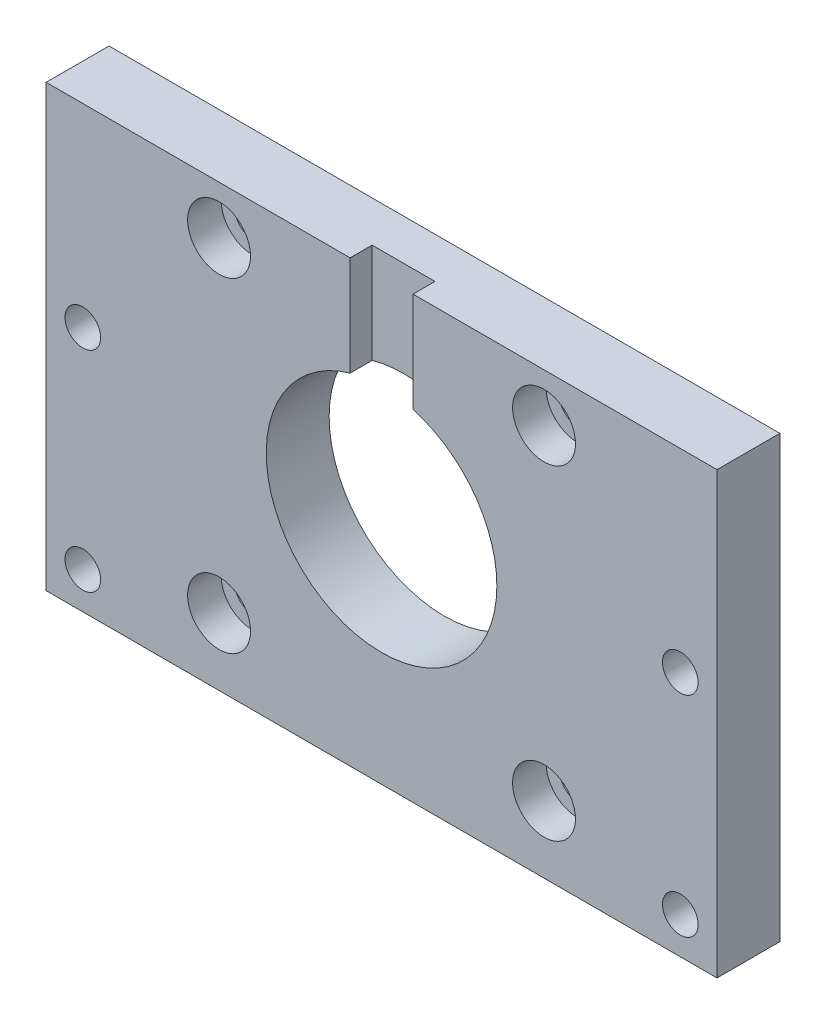
ISO-10303-21;
HEADER;
FILE_DESCRIPTION(('STEP AP214'),'2;1');
FILE_NAME('part.step','',(''),(''),'','','');
FILE_SCHEMA(('AUTOMOTIVE_DESIGN { 1 0 10303 214 1 1 1 1 }'));
ENDSEC;
DATA;
#1=APPLICATION_CONTEXT('core data for automotive mechanical design processes');
#2=APPLICATION_PROTOCOL_DEFINITION('international standard','automotive_design',2000,#1);
#3=PRODUCT_CONTEXT('',#1,'mechanical');
#4=PRODUCT('Part','Part','',(#3));
#5=PRODUCT_RELATED_PRODUCT_CATEGORY('part','',(#4));
#6=PRODUCT_DEFINITION_FORMATION('','',#4);
#7=PRODUCT_DEFINITION_CONTEXT('part definition',#1,'design');
#8=PRODUCT_DEFINITION('design','',#6,#7);
#9=PRODUCT_DEFINITION_SHAPE('','',#8);
#10=(LENGTH_UNIT() NAMED_UNIT(*) SI_UNIT(.MILLI.,.METRE.));
#11=(NAMED_UNIT(*) PLANE_ANGLE_UNIT() SI_UNIT($,.RADIAN.));
#12=(NAMED_UNIT(*) SI_UNIT($,.STERADIAN.) SOLID_ANGLE_UNIT());
#13=UNCERTAINTY_MEASURE_WITH_UNIT(LENGTH_MEASURE(1.E-05),#10,'distance_accuracy_value','');
#14=(GEOMETRIC_REPRESENTATION_CONTEXT(3) GLOBAL_UNCERTAINTY_ASSIGNED_CONTEXT((#13)) GLOBAL_UNIT_ASSIGNED_CONTEXT((#10,
#11,#12)) REPRESENTATION_CONTEXT('',''));
#15=CARTESIAN_POINT('',(0.,0.,0.));
#16=DIRECTION('',(0.,0.,1.));
#17=DIRECTION('',(1.,0.,0.));
#18=AXIS2_PLACEMENT_3D('',#15,#16,#17);
#19=CARTESIAN_POINT('',(3.5,3.5,3.));
#20=DIRECTION('',(0.,0.,-1.));
#21=DIRECTION('',(-1.,0.,0.));
#22=AXIS2_PLACEMENT_3D('',#19,#20,#21);
#23=CYLINDRICAL_SURFACE('',#22,3.);
#24=CARTESIAN_POINT('',(3.5,3.5,0.));
#25=DIRECTION('',(0.,0.,-1.));
#26=DIRECTION('',(-1.,0.,0.));
#27=AXIS2_PLACEMENT_3D('',#24,#25,#26);
#28=CIRCLE('',#27,3.);
#29=CARTESIAN_POINT('',(0.5,3.5,0.));
#30=VERTEX_POINT('',#29);
#31=EDGE_CURVE('E209',#30,#30,#28,.F.);
#32=ORIENTED_EDGE('',*,*,#31,.F.);
#33=EDGE_LOOP('',(#32));
#34=FACE_BOUND('',#33,.T.);
#35=CARTESIAN_POINT('',(3.5,3.5,3.));
#36=DIRECTION('',(0.,0.,-1.));
#37=DIRECTION('',(-1.,0.,0.));
#38=AXIS2_PLACEMENT_3D('',#35,#36,#37);
#39=CIRCLE('',#38,3.);
#40=CARTESIAN_POINT('',(0.5,3.5,3.));
#41=VERTEX_POINT('',#40);
#42=EDGE_CURVE('E21',#41,#41,#39,.F.);
#43=ORIENTED_EDGE('',*,*,#42,.T.);
#44=EDGE_LOOP('',(#43));
#45=FACE_BOUND('',#44,.T.);
#46=ADVANCED_FACE('F17',(#34,#45),#23,.F.);
#47=CARTESIAN_POINT('',(60.5,23.5,3.));
#48=DIRECTION('',(0.,0.,-1.));
#49=DIRECTION('',(-1.,0.,0.));
#50=AXIS2_PLACEMENT_3D('',#47,#48,#49);
#51=CYLINDRICAL_SURFACE('',#50,3.);
#52=CARTESIAN_POINT('',(60.5,23.5,0.));
#53=DIRECTION('',(0.,0.,-1.));
#54=DIRECTION('',(-1.,0.,0.));
#55=AXIS2_PLACEMENT_3D('',#52,#53,#54);
#56=CIRCLE('',#55,3.);
#57=CARTESIAN_POINT('',(57.5,23.5,0.));
#58=VERTEX_POINT('',#57);
#59=EDGE_CURVE('E206',#58,#58,#56,.F.);
#60=ORIENTED_EDGE('',*,*,#59,.F.);
#61=EDGE_LOOP('',(#60));
#62=FACE_BOUND('',#61,.T.);
#63=CARTESIAN_POINT('',(60.5,23.5,3.));
#64=DIRECTION('',(0.,0.,-1.));
#65=DIRECTION('',(-1.,0.,0.));
#66=AXIS2_PLACEMENT_3D('',#63,#64,#65);
#67=CIRCLE('',#66,3.);
#68=CARTESIAN_POINT('',(57.5,23.5,3.));
#69=VERTEX_POINT('',#68);
#70=EDGE_CURVE('E226',#69,#69,#67,.F.);
#71=ORIENTED_EDGE('',*,*,#70,.T.);
#72=EDGE_LOOP('',(#71));
#73=FACE_BOUND('',#72,.T.);
#74=ADVANCED_FACE('F317',(#62,#73),#51,.F.);
#75=CARTESIAN_POINT('',(60.5,3.5,3.));
#76=DIRECTION('',(0.,0.,-1.));
#77=DIRECTION('',(-1.,0.,0.));
#78=AXIS2_PLACEMENT_3D('',#75,#76,#77);
#79=CYLINDRICAL_SURFACE('',#78,3.);
#80=CARTESIAN_POINT('',(60.5,3.5,0.));
#81=DIRECTION('',(0.,0.,-1.));
#82=DIRECTION('',(-1.,0.,0.));
#83=AXIS2_PLACEMENT_3D('',#80,#81,#82);
#84=CIRCLE('',#83,3.);
#85=CARTESIAN_POINT('',(57.5,3.5,0.));
#86=VERTEX_POINT('',#85);
#87=EDGE_CURVE('E203',#86,#86,#84,.F.);
#88=ORIENTED_EDGE('',*,*,#87,.F.);
#89=EDGE_LOOP('',(#88));
#90=FACE_BOUND('',#89,.T.);
#91=CARTESIAN_POINT('',(60.5,3.5,3.));
#92=DIRECTION('',(0.,0.,-1.));
#93=DIRECTION('',(-1.,0.,0.));
#94=AXIS2_PLACEMENT_3D('',#91,#92,#93);
#95=CIRCLE('',#94,3.);
#96=CARTESIAN_POINT('',(57.5,3.5,3.));
#97=VERTEX_POINT('',#96);
#98=EDGE_CURVE('E224',#97,#97,#95,.F.);
#99=ORIENTED_EDGE('',*,*,#98,.T.);
#100=EDGE_LOOP('',(#99));
#101=FACE_BOUND('',#100,.T.);
#102=ADVANCED_FACE('F313',(#90,#101),#79,.F.);
#103=CARTESIAN_POINT('',(47.5,37.39,0.));
#104=DIRECTION('',(0.,0.,1.));
#105=DIRECTION('',(1.,0.,0.));
#106=AXIS2_PLACEMENT_3D('',#103,#104,#105);
#107=CYLINDRICAL_SURFACE('',#106,1.7);
#108=CARTESIAN_POINT('',(47.5,37.39,2.8));
#109=DIRECTION('',(0.,0.,1.));
#110=DIRECTION('',(1.,0.,0.));
#111=AXIS2_PLACEMENT_3D('',#108,#109,#110);
#112=CIRCLE('',#111,1.7);
#113=CARTESIAN_POINT('',(49.2,37.39,2.8));
#114=VERTEX_POINT('',#113);
#115=EDGE_CURVE('E221',#114,#114,#112,.T.);
#116=ORIENTED_EDGE('',*,*,#115,.T.);
#117=EDGE_LOOP('',(#116));
#118=FACE_BOUND('',#117,.T.);
#119=CARTESIAN_POINT('',(47.5,37.39,0.));
#120=DIRECTION('',(0.,0.,1.));
#121=DIRECTION('',(1.,0.,0.));
#122=AXIS2_PLACEMENT_3D('',#119,#120,#121);
#123=CIRCLE('',#122,1.7);
#124=CARTESIAN_POINT('',(49.2,37.39,0.));
#125=VERTEX_POINT('',#124);
#126=EDGE_CURVE('E200',#125,#125,#123,.T.);
#127=ORIENTED_EDGE('',*,*,#126,.F.);
#128=EDGE_LOOP('',(#127));
#129=FACE_BOUND('',#128,.T.);
#130=ADVANCED_FACE('F309',(#118,#129),#107,.F.);
#131=CARTESIAN_POINT('',(47.5,6.39,0.));
#132=DIRECTION('',(0.,0.,1.));
#133=DIRECTION('',(1.,0.,0.));
#134=AXIS2_PLACEMENT_3D('',#131,#132,#133);
#135=CYLINDRICAL_SURFACE('',#134,1.7);
#136=CARTESIAN_POINT('',(47.5,6.39,2.8));
#137=DIRECTION('',(0.,0.,1.));
#138=DIRECTION('',(1.,0.,0.));
#139=AXIS2_PLACEMENT_3D('',#136,#137,#138);
#140=CIRCLE('',#139,1.7);
#141=CARTESIAN_POINT('',(49.2,6.39,2.8));
#142=VERTEX_POINT('',#141);
#143=EDGE_CURVE('E218',#142,#142,#140,.T.);
#144=ORIENTED_EDGE('',*,*,#143,.T.);
#145=EDGE_LOOP('',(#144));
#146=FACE_BOUND('',#145,.T.);
#147=CARTESIAN_POINT('',(47.5,6.39,0.));
#148=DIRECTION('',(0.,0.,1.));
#149=DIRECTION('',(1.,0.,0.));
#150=AXIS2_PLACEMENT_3D('',#147,#148,#149);
#151=CIRCLE('',#150,1.7);
#152=CARTESIAN_POINT('',(49.2,6.39,0.));
#153=VERTEX_POINT('',#152);
#154=EDGE_CURVE('E197',#153,#153,#151,.T.);
#155=ORIENTED_EDGE('',*,*,#154,.F.);
#156=EDGE_LOOP('',(#155));
#157=FACE_BOUND('',#156,.T.);
#158=ADVANCED_FACE('F305',(#146,#157),#135,.F.);
#159=CARTESIAN_POINT('',(16.5,37.39,0.));
#160=DIRECTION('',(0.,0.,1.));
#161=DIRECTION('',(1.,0.,0.));
#162=AXIS2_PLACEMENT_3D('',#159,#160,#161);
#163=CYLINDRICAL_SURFACE('',#162,1.7);
#164=CARTESIAN_POINT('',(16.5,37.39,2.8));
#165=DIRECTION('',(0.,0.,1.));
#166=DIRECTION('',(1.,0.,0.));
#167=AXIS2_PLACEMENT_3D('',#164,#165,#166);
#168=CIRCLE('',#167,1.7);
#169=CARTESIAN_POINT('',(18.2,37.39,2.8));
#170=VERTEX_POINT('',#169);
#171=EDGE_CURVE('E215',#170,#170,#168,.T.);
#172=ORIENTED_EDGE('',*,*,#171,.T.);
#173=EDGE_LOOP('',(#172));
#174=FACE_BOUND('',#173,.T.);
#175=CARTESIAN_POINT('',(16.5,37.39,0.));
#176=DIRECTION('',(0.,0.,1.));
#177=DIRECTION('',(1.,0.,0.));
#178=AXIS2_PLACEMENT_3D('',#175,#176,#177);
#179=CIRCLE('',#178,1.7);
#180=CARTESIAN_POINT('',(18.2,37.39,0.));
#181=VERTEX_POINT('',#180);
#182=EDGE_CURVE('E194',#181,#181,#179,.T.);
#183=ORIENTED_EDGE('',*,*,#182,.F.);
#184=EDGE_LOOP('',(#183));
#185=FACE_BOUND('',#184,.T.);
#186=ADVANCED_FACE('F301',(#174,#185),#163,.F.);
#187=CARTESIAN_POINT('',(16.5,6.39,0.));
#188=DIRECTION('',(0.,0.,1.));
#189=DIRECTION('',(1.,0.,0.));
#190=AXIS2_PLACEMENT_3D('',#187,#188,#189);
#191=CYLINDRICAL_SURFACE('',#190,1.7);
#192=CARTESIAN_POINT('',(16.5,6.39,2.8));
#193=DIRECTION('',(0.,0.,1.));
#194=DIRECTION('',(1.,0.,0.));
#195=AXIS2_PLACEMENT_3D('',#192,#193,#194);
#196=CIRCLE('',#195,1.7);
#197=CARTESIAN_POINT('',(18.2,6.39,2.8));
#198=VERTEX_POINT('',#197);
#199=EDGE_CURVE('E212',#198,#198,#196,.T.);
#200=ORIENTED_EDGE('',*,*,#199,.T.);
#201=EDGE_LOOP('',(#200));
#202=FACE_BOUND('',#201,.T.);
#203=CARTESIAN_POINT('',(16.5,6.39,0.));
#204=DIRECTION('',(0.,0.,1.));
#205=DIRECTION('',(1.,0.,0.));
#206=AXIS2_PLACEMENT_3D('',#203,#204,#205);
#207=CIRCLE('',#206,1.7);
#208=CARTESIAN_POINT('',(18.2,6.39,0.));
#209=VERTEX_POINT('',#208);
#210=EDGE_CURVE('E191',#209,#209,#207,.T.);
#211=ORIENTED_EDGE('',*,*,#210,.F.);
#212=EDGE_LOOP('',(#211));
#213=FACE_BOUND('',#212,.T.);
#214=ADVANCED_FACE('F248',(#202,#213),#191,.F.);
#215=CARTESIAN_POINT('',(29.,32.415843276,3.9));
#216=DIRECTION('',(0.,0.,1.));
#217=DIRECTION('',(1.,0.,0.));
#218=AXIS2_PLACEMENT_3D('',#215,#216,#217);
#219=PLANE('',#218);
#220=DIRECTION('',(-1.,0.,0.));
#221=VECTOR('',#220,1.);
#222=CARTESIAN_POINT('',(32.,42.,3.9));
#223=LINE('',#222,#221);
#224=CARTESIAN_POINT('',(35.,42.,3.9));
#225=VERTEX_POINT('',#224);
#226=CARTESIAN_POINT('',(29.,42.,3.9));
#227=VERTEX_POINT('',#226);
#228=EDGE_CURVE('E61',#225,#227,#223,.T.);
#229=ORIENTED_EDGE('',*,*,#228,.T.);
#230=DIRECTION('',(0.,-1.,0.));
#231=VECTOR('',#230,1.);
#232=CARTESIAN_POINT('',(29.,37.236502622,3.9));
#233=LINE('',#232,#231);
#234=CARTESIAN_POINT('',(28.9999999976637,32.4730052435961,3.9));
#235=VERTEX_POINT('',#234);
#236=EDGE_CURVE('E190',#227,#235,#233,.T.);
#237=ORIENTED_EDGE('',*,*,#236,.T.);
#238=CARTESIAN_POINT('',(32.,21.89,3.9));
#239=DIRECTION('',(0.,0.,1.));
#240=DIRECTION('',(1.,0.,0.));
#241=AXIS2_PLACEMENT_3D('',#238,#239,#240);
#242=CIRCLE('',#241,11.);
#243=CARTESIAN_POINT('',(35.0000000001657,32.4730052442114,3.9));
#244=VERTEX_POINT('',#243);
#245=EDGE_CURVE('E184',#244,#235,#242,.T.);
#246=ORIENTED_EDGE('',*,*,#245,.F.);
#247=DIRECTION('',(0.,1.,0.));
#248=VECTOR('',#247,1.);
#249=CARTESIAN_POINT('',(35.,37.236502622,3.9));
#250=LINE('',#249,#248);
#251=EDGE_CURVE('E54',#244,#225,#250,.T.);
#252=ORIENTED_EDGE('',*,*,#251,.T.);
#253=EDGE_LOOP('',(#229,#237,#246,#252));
#254=FACE_BOUND('',#253,.T.);
#255=ADVANCED_FACE('F237',(#254),#219,.T.);
#256=CARTESIAN_POINT('',(0.464,0.464,3.));
#257=DIRECTION('',(0.,0.,1.));
#258=DIRECTION('',(1.,0.,0.));
#259=AXIS2_PLACEMENT_3D('',#256,#257,#258);
#260=PLANE('',#259);
#261=CARTESIAN_POINT('',(3.5,3.5,3.));
#262=DIRECTION('',(0.,0.,-1.));
#263=DIRECTION('',(-1.,0.,0.));
#264=AXIS2_PLACEMENT_3D('',#261,#262,#263);
#265=CIRCLE('',#264,1.7);
#266=CARTESIAN_POINT('',(1.8,3.5,3.));
#267=VERTEX_POINT('',#266);
#268=EDGE_CURVE('E181',#267,#267,#265,.T.);
#269=ORIENTED_EDGE('',*,*,#268,.F.);
#270=EDGE_LOOP('',(#269));
#271=FACE_BOUND('',#270,.T.);
#272=ORIENTED_EDGE('',*,*,#42,.F.);
#273=EDGE_LOOP('',(#272));
#274=FACE_BOUND('',#273,.T.);
#275=ADVANCED_FACE('F234',(#271,#274),#260,.F.);
#276=CARTESIAN_POINT('',(57.464,20.464,3.));
#277=DIRECTION('',(0.,0.,1.));
#278=DIRECTION('',(1.,0.,0.));
#279=AXIS2_PLACEMENT_3D('',#276,#277,#278);
#280=PLANE('',#279);
#281=CARTESIAN_POINT('',(60.5,23.5,3.));
#282=DIRECTION('',(0.,0.,-1.));
#283=DIRECTION('',(-1.,0.,0.));
#284=AXIS2_PLACEMENT_3D('',#281,#282,#283);
#285=CIRCLE('',#284,1.7);
#286=CARTESIAN_POINT('',(58.8,23.5,3.));
#287=VERTEX_POINT('',#286);
#288=EDGE_CURVE('E178',#287,#287,#285,.T.);
#289=ORIENTED_EDGE('',*,*,#288,.F.);
#290=EDGE_LOOP('',(#289));
#291=FACE_BOUND('',#290,.T.);
#292=ORIENTED_EDGE('',*,*,#70,.F.);
#293=EDGE_LOOP('',(#292));
#294=FACE_BOUND('',#293,.T.);
#295=ADVANCED_FACE('F236',(#291,#294),#280,.F.);
#296=CARTESIAN_POINT('',(57.464,0.464,3.));
#297=DIRECTION('',(0.,0.,1.));
#298=DIRECTION('',(1.,0.,0.));
#299=AXIS2_PLACEMENT_3D('',#296,#297,#298);
#300=PLANE('',#299);
#301=CARTESIAN_POINT('',(60.5,3.5,3.));
#302=DIRECTION('',(0.,0.,-1.));
#303=DIRECTION('',(-1.,0.,0.));
#304=AXIS2_PLACEMENT_3D('',#301,#302,#303);
#305=CIRCLE('',#304,1.7);
#306=CARTESIAN_POINT('',(58.8,3.5,3.));
#307=VERTEX_POINT('',#306);
#308=EDGE_CURVE('E175',#307,#307,#305,.T.);
#309=ORIENTED_EDGE('',*,*,#308,.F.);
#310=EDGE_LOOP('',(#309));
#311=FACE_BOUND('',#310,.T.);
#312=ORIENTED_EDGE('',*,*,#98,.F.);
#313=EDGE_LOOP('',(#312));
#314=FACE_BOUND('',#313,.T.);
#315=ADVANCED_FACE('F245',(#311,#314),#300,.F.);
#316=CARTESIAN_POINT('',(50.536,34.354,2.8));
#317=DIRECTION('',(0.,0.,-1.));
#318=DIRECTION('',(-1.,0.,0.));
#319=AXIS2_PLACEMENT_3D('',#316,#317,#318);
#320=PLANE('',#319);
#321=ORIENTED_EDGE('',*,*,#115,.F.);
#322=EDGE_LOOP('',(#321));
#323=FACE_BOUND('',#322,.T.);
#324=CARTESIAN_POINT('',(47.5,37.39,2.8));
#325=DIRECTION('',(0.,0.,1.));
#326=DIRECTION('',(1.,0.,0.));
#327=AXIS2_PLACEMENT_3D('',#324,#325,#326);
#328=CIRCLE('',#327,3.);
#329=CARTESIAN_POINT('',(50.5,37.39,2.8));
#330=VERTEX_POINT('',#329);
#331=EDGE_CURVE('E172',#330,#330,#328,.F.);
#332=ORIENTED_EDGE('',*,*,#331,.F.);
#333=EDGE_LOOP('',(#332));
#334=FACE_BOUND('',#333,.T.);
#335=ADVANCED_FACE('F455',(#323,#334),#320,.F.);
#336=CARTESIAN_POINT('',(50.536,3.354,2.8));
#337=DIRECTION('',(0.,0.,-1.));
#338=DIRECTION('',(-1.,0.,0.));
#339=AXIS2_PLACEMENT_3D('',#336,#337,#338);
#340=PLANE('',#339);
#341=ORIENTED_EDGE('',*,*,#143,.F.);
#342=EDGE_LOOP('',(#341));
#343=FACE_BOUND('',#342,.T.);
#344=CARTESIAN_POINT('',(47.5,6.39,2.8));
#345=DIRECTION('',(0.,0.,1.));
#346=DIRECTION('',(1.,0.,0.));
#347=AXIS2_PLACEMENT_3D('',#344,#345,#346);
#348=CIRCLE('',#347,3.);
#349=CARTESIAN_POINT('',(50.5,6.39,2.8));
#350=VERTEX_POINT('',#349);
#351=EDGE_CURVE('E169',#350,#350,#348,.F.);
#352=ORIENTED_EDGE('',*,*,#351,.F.);
#353=EDGE_LOOP('',(#352));
#354=FACE_BOUND('',#353,.T.);
#355=ADVANCED_FACE('F462',(#343,#354),#340,.F.);
#356=CARTESIAN_POINT('',(19.536,34.354,2.8));
#357=DIRECTION('',(0.,0.,-1.));
#358=DIRECTION('',(-1.,0.,0.));
#359=AXIS2_PLACEMENT_3D('',#356,#357,#358);
#360=PLANE('',#359);
#361=ORIENTED_EDGE('',*,*,#171,.F.);
#362=EDGE_LOOP('',(#361));
#363=FACE_BOUND('',#362,.T.);
#364=CARTESIAN_POINT('',(16.5,37.39,2.8));
#365=DIRECTION('',(0.,0.,1.));
#366=DIRECTION('',(1.,0.,0.));
#367=AXIS2_PLACEMENT_3D('',#364,#365,#366);
#368=CIRCLE('',#367,3.);
#369=CARTESIAN_POINT('',(19.5,37.39,2.8));
#370=VERTEX_POINT('',#369);
#371=EDGE_CURVE('E166',#370,#370,#368,.F.);
#372=ORIENTED_EDGE('',*,*,#371,.F.);
#373=EDGE_LOOP('',(#372));
#374=FACE_BOUND('',#373,.T.);
#375=ADVANCED_FACE('F341',(#363,#374),#360,.F.);
#376=CARTESIAN_POINT('',(19.536,3.354,2.8));
#377=DIRECTION('',(0.,0.,-1.));
#378=DIRECTION('',(-1.,0.,0.));
#379=AXIS2_PLACEMENT_3D('',#376,#377,#378);
#380=PLANE('',#379);
#381=ORIENTED_EDGE('',*,*,#199,.F.);
#382=EDGE_LOOP('',(#381));
#383=FACE_BOUND('',#382,.T.);
#384=CARTESIAN_POINT('',(16.5,6.39,2.8));
#385=DIRECTION('',(0.,0.,1.));
#386=DIRECTION('',(1.,0.,0.));
#387=AXIS2_PLACEMENT_3D('',#384,#385,#386);
#388=CIRCLE('',#387,3.);
#389=CARTESIAN_POINT('',(19.5,6.39,2.8));
#390=VERTEX_POINT('',#389);
#391=EDGE_CURVE('E163',#390,#390,#388,.F.);
#392=ORIENTED_EDGE('',*,*,#391,.F.);
#393=EDGE_LOOP('',(#392));
#394=FACE_BOUND('',#393,.T.);
#395=ADVANCED_FACE('F331',(#383,#394),#380,.F.);
#396=CARTESIAN_POINT('',(64.,0.,0.));
#397=DIRECTION('',(0.,0.,-1.));
#398=DIRECTION('',(-1.,0.,0.));
#399=AXIS2_PLACEMENT_3D('',#396,#397,#398);
#400=PLANE('',#399);
#401=ORIENTED_EDGE('',*,*,#210,.T.);
#402=EDGE_LOOP('',(#401));
#403=FACE_BOUND('',#402,.T.);
#404=CARTESIAN_POINT('',(32.,21.89,0.));
#405=DIRECTION('',(0.,0.,1.));
#406=DIRECTION('',(1.,0.,0.));
#407=AXIS2_PLACEMENT_3D('',#404,#405,#406);
#408=CIRCLE('',#407,11.);
#409=CARTESIAN_POINT('',(43.,21.89,0.));
#410=VERTEX_POINT('',#409);
#411=EDGE_CURVE('E187',#410,#410,#408,.F.);
#412=ORIENTED_EDGE('',*,*,#411,.F.);
#413=EDGE_LOOP('',(#412));
#414=FACE_BOUND('',#413,.T.);
#415=ORIENTED_EDGE('',*,*,#182,.T.);
#416=EDGE_LOOP('',(#415));
#417=FACE_BOUND('',#416,.T.);
#418=ORIENTED_EDGE('',*,*,#154,.T.);
#419=EDGE_LOOP('',(#418));
#420=FACE_BOUND('',#419,.T.);
#421=ORIENTED_EDGE('',*,*,#126,.T.);
#422=EDGE_LOOP('',(#421));
#423=FACE_BOUND('',#422,.T.);
#424=ORIENTED_EDGE('',*,*,#87,.T.);
#425=EDGE_LOOP('',(#424));
#426=FACE_BOUND('',#425,.T.);
#427=ORIENTED_EDGE('',*,*,#59,.T.);
#428=EDGE_LOOP('',(#427));
#429=FACE_BOUND('',#428,.T.);
#430=ORIENTED_EDGE('',*,*,#31,.T.);
#431=EDGE_LOOP('',(#430));
#432=FACE_BOUND('',#431,.T.);
#433=CARTESIAN_POINT('',(3.5,23.5,0.));
#434=DIRECTION('',(0.,0.,-1.));
#435=DIRECTION('',(-1.,0.,0.));
#436=AXIS2_PLACEMENT_3D('',#433,#434,#435);
#437=CIRCLE('',#436,3.);
#438=CARTESIAN_POINT('',(0.5,23.5,0.));
#439=VERTEX_POINT('',#438);
#440=EDGE_CURVE('E159',#439,#439,#437,.T.);
#441=ORIENTED_EDGE('',*,*,#440,.F.);
#442=EDGE_LOOP('',(#441));
#443=FACE_BOUND('',#442,.T.);
#444=DIRECTION('',(0.,-1.,0.));
#445=VECTOR('',#444,1.);
#446=CARTESIAN_POINT('',(64.,21.,0.));
#447=LINE('',#446,#445);
#448=CARTESIAN_POINT('',(64.,42.,0.));
#449=VERTEX_POINT('',#448);
#450=CARTESIAN_POINT('',(64.,0.,0.));
#451=VERTEX_POINT('',#450);
#452=EDGE_CURVE('E89',#449,#451,#447,.T.);
#453=ORIENTED_EDGE('',*,*,#452,.T.);
#454=DIRECTION('',(-1.,0.,0.));
#455=VECTOR('',#454,1.);
#456=CARTESIAN_POINT('',(32.,0.,0.));
#457=LINE('',#456,#455);
#458=CARTESIAN_POINT('',(0.,0.,0.));
#459=VERTEX_POINT('',#458);
#460=EDGE_CURVE('E126',#451,#459,#457,.T.);
#461=ORIENTED_EDGE('',*,*,#460,.T.);
#462=DIRECTION('',(0.,1.,0.));
#463=VECTOR('',#462,1.);
#464=CARTESIAN_POINT('',(0.,21.,0.));
#465=LINE('',#464,#463);
#466=CARTESIAN_POINT('',(0.,42.,0.));
#467=VERTEX_POINT('',#466);
#468=EDGE_CURVE('E113',#459,#467,#465,.T.);
#469=ORIENTED_EDGE('',*,*,#468,.T.);
#470=DIRECTION('',(1.,0.,0.));
#471=VECTOR('',#470,1.);
#472=CARTESIAN_POINT('',(32.,42.,0.));
#473=LINE('',#472,#471);
#474=EDGE_CURVE('E105',#467,#449,#473,.T.);
#475=ORIENTED_EDGE('',*,*,#474,.T.);
#476=EDGE_LOOP('',(#453,#461,#469,#475));
#477=FACE_BOUND('',#476,.T.);
#478=ADVANCED_FACE('F111',(#403,#414,#417,#420,#423,#426,#429,#432,#443,#477),#400,.T.);
#479=CARTESIAN_POINT('',(35.,32.473005244,6.));
#480=DIRECTION('',(1.,0.,0.));
#481=DIRECTION('',(0.,0.,-1.));
#482=AXIS2_PLACEMENT_3D('',#479,#480,#481);
#483=PLANE('',#482);
#484=DIRECTION('',(0.,0.,-1.));
#485=VECTOR('',#484,1.);
#486=CARTESIAN_POINT('',(35.,42.,3.));
#487=LINE('',#486,#485);
#488=CARTESIAN_POINT('',(35.,42.,6.));
#489=VERTEX_POINT('',#488);
#490=EDGE_CURVE('E109',#489,#225,#487,.T.);
#491=ORIENTED_EDGE('',*,*,#490,.T.);
#492=ORIENTED_EDGE('',*,*,#251,.F.);
#493=DIRECTION('',(0.,0.,1.));
#494=VECTOR('',#493,1.);
#495=CARTESIAN_POINT('',(35.0000000003313,32.4730052441645,3.));
#496=LINE('',#495,#494);
#497=CARTESIAN_POINT('',(35.0000000001657,32.4730052442114,6.));
#498=VERTEX_POINT('',#497);
#499=EDGE_CURVE('E186',#498,#244,#496,.F.);
#500=ORIENTED_EDGE('',*,*,#499,.F.);
#501=DIRECTION('',(0.,1.,0.));
#502=VECTOR('',#501,1.);
#503=CARTESIAN_POINT('',(35.,21.,6.));
#504=LINE('',#503,#502);
#505=EDGE_CURVE('E162',#498,#489,#504,.T.);
#506=ORIENTED_EDGE('',*,*,#505,.T.);
#507=EDGE_LOOP('',(#491,#492,#500,#506));
#508=FACE_BOUND('',#507,.T.);
#509=ADVANCED_FACE('F330',(#508),#483,.F.);
#510=CARTESIAN_POINT('',(64.,0.,0.));
#511=DIRECTION('',(-1.,0.,0.));
#512=DIRECTION('',(0.,0.,1.));
#513=AXIS2_PLACEMENT_3D('',#510,#511,#512);
#514=PLANE('',#513);
#515=DIRECTION('',(0.,0.,1.));
#516=VECTOR('',#515,1.);
#517=CARTESIAN_POINT('',(64.,42.,3.));
#518=LINE('',#517,#516);
#519=CARTESIAN_POINT('',(64.,42.,6.));
#520=VERTEX_POINT('',#519);
#521=EDGE_CURVE('E93',#449,#520,#518,.T.);
#522=ORIENTED_EDGE('',*,*,#521,.T.);
#523=DIRECTION('',(0.,-1.,0.));
#524=VECTOR('',#523,1.);
#525=CARTESIAN_POINT('',(64.,21.,6.));
#526=LINE('',#525,#524);
#527=CARTESIAN_POINT('',(64.,0.,6.));
#528=VERTEX_POINT('',#527);
#529=EDGE_CURVE('E411',#520,#528,#526,.T.);
#530=ORIENTED_EDGE('',*,*,#529,.T.);
#531=DIRECTION('',(0.,0.,-1.));
#532=VECTOR('',#531,1.);
#533=CARTESIAN_POINT('',(64.,0.,3.));
#534=LINE('',#533,#532);
#535=EDGE_CURVE('E95',#528,#451,#534,.T.);
#536=ORIENTED_EDGE('',*,*,#535,.T.);
#537=ORIENTED_EDGE('',*,*,#452,.F.);
#538=EDGE_LOOP('',(#522,#530,#536,#537));
#539=FACE_BOUND('',#538,.T.);
#540=ADVANCED_FACE('F91',(#539),#514,.F.);
#541=CARTESIAN_POINT('',(0.,0.,0.));
#542=DIRECTION('',(0.,1.,0.));
#543=DIRECTION('',(0.,0.,1.));
#544=AXIS2_PLACEMENT_3D('',#541,#542,#543);
#545=PLANE('',#544);
#546=ORIENTED_EDGE('',*,*,#535,.F.);
#547=DIRECTION('',(-1.,0.,0.));
#548=VECTOR('',#547,1.);
#549=CARTESIAN_POINT('',(32.,0.,6.));
#550=LINE('',#549,#548);
#551=CARTESIAN_POINT('',(0.,0.,6.));
#552=VERTEX_POINT('',#551);
#553=EDGE_CURVE('E393',#528,#552,#550,.T.);
#554=ORIENTED_EDGE('',*,*,#553,.T.);
#555=DIRECTION('',(0.,0.,-1.));
#556=VECTOR('',#555,1.);
#557=CARTESIAN_POINT('',(0.,0.,3.));
#558=LINE('',#557,#556);
#559=EDGE_CURVE('E123',#552,#459,#558,.T.);
#560=ORIENTED_EDGE('',*,*,#559,.T.);
#561=ORIENTED_EDGE('',*,*,#460,.F.);
#562=EDGE_LOOP('',(#546,#554,#560,#561));
#563=FACE_BOUND('',#562,.T.);
#564=ADVANCED_FACE('F349',(#563),#545,.F.);
#565=CARTESIAN_POINT('',(0.,0.,6.));
#566=DIRECTION('',(1.,0.,0.));
#567=DIRECTION('',(0.,0.,-1.));
#568=AXIS2_PLACEMENT_3D('',#565,#566,#567);
#569=PLANE('',#568);
#570=ORIENTED_EDGE('',*,*,#559,.F.);
#571=DIRECTION('',(0.,1.,0.));
#572=VECTOR('',#571,1.);
#573=CARTESIAN_POINT('',(0.,21.,6.));
#574=LINE('',#573,#572);
#575=CARTESIAN_POINT('',(0.,42.,6.));
#576=VERTEX_POINT('',#575);
#577=EDGE_CURVE('E391',#552,#576,#574,.T.);
#578=ORIENTED_EDGE('',*,*,#577,.T.);
#579=DIRECTION('',(0.,0.,-1.));
#580=VECTOR('',#579,1.);
#581=CARTESIAN_POINT('',(0.,42.,3.));
#582=LINE('',#581,#580);
#583=EDGE_CURVE('E114',#576,#467,#582,.T.);
#584=ORIENTED_EDGE('',*,*,#583,.T.);
#585=ORIENTED_EDGE('',*,*,#468,.F.);
#586=EDGE_LOOP('',(#570,#578,#584,#585));
#587=FACE_BOUND('',#586,.T.);
#588=ADVANCED_FACE('F352',(#587),#569,.F.);
#589=CARTESIAN_POINT('',(0.,42.,6.));
#590=DIRECTION('',(0.,-1.,0.));
#591=DIRECTION('',(0.,0.,-1.));
#592=AXIS2_PLACEMENT_3D('',#589,#590,#591);
#593=PLANE('',#592);
#594=DIRECTION('',(0.,0.,-1.));
#595=VECTOR('',#594,1.);
#596=CARTESIAN_POINT('',(29.,42.,4.95));
#597=LINE('',#596,#595);
#598=CARTESIAN_POINT('',(29.,42.,6.));
#599=VERTEX_POINT('',#598);
#600=EDGE_CURVE('E390',#599,#227,#597,.T.);
#601=ORIENTED_EDGE('',*,*,#600,.T.);
#602=ORIENTED_EDGE('',*,*,#228,.F.);
#603=ORIENTED_EDGE('',*,*,#490,.F.);
#604=DIRECTION('',(1.,0.,0.));
#605=VECTOR('',#604,1.);
#606=CARTESIAN_POINT('',(32.,42.,6.));
#607=LINE('',#606,#605);
#608=EDGE_CURVE('E108',#489,#520,#607,.T.);
#609=ORIENTED_EDGE('',*,*,#608,.T.);
#610=ORIENTED_EDGE('',*,*,#521,.F.);
#611=ORIENTED_EDGE('',*,*,#474,.F.);
#612=ORIENTED_EDGE('',*,*,#583,.F.);
#613=DIRECTION('',(1.,0.,0.));
#614=VECTOR('',#613,1.);
#615=CARTESIAN_POINT('',(32.,42.,6.));
#616=LINE('',#615,#614);
#617=EDGE_CURVE('E386',#576,#599,#616,.T.);
#618=ORIENTED_EDGE('',*,*,#617,.T.);
#619=EDGE_LOOP('',(#601,#602,#603,#609,#610,#611,#612,#618));
#620=FACE_BOUND('',#619,.T.);
#621=ADVANCED_FACE('F104',(#620),#593,.F.);
#622=CARTESIAN_POINT('',(29.,32.473005244,3.9));
#623=DIRECTION('',(-1.,0.,0.));
#624=DIRECTION('',(0.,0.,1.));
#625=AXIS2_PLACEMENT_3D('',#622,#623,#624);
#626=PLANE('',#625);
#627=DIRECTION('',(0.,0.,-1.));
#628=VECTOR('',#627,1.);
#629=CARTESIAN_POINT('',(28.9999999953275,32.4730052429338,3.));
#630=LINE('',#629,#628);
#631=CARTESIAN_POINT('',(28.9999999976637,32.4730052435961,6.));
#632=VERTEX_POINT('',#631);
#633=EDGE_CURVE('E36',#235,#632,#630,.F.);
#634=ORIENTED_EDGE('',*,*,#633,.F.);
#635=ORIENTED_EDGE('',*,*,#236,.F.);
#636=ORIENTED_EDGE('',*,*,#600,.F.);
#637=DIRECTION('',(0.,-1.,0.));
#638=VECTOR('',#637,1.);
#639=CARTESIAN_POINT('',(29.,21.,6.));
#640=LINE('',#639,#638);
#641=EDGE_CURVE('E158',#599,#632,#640,.T.);
#642=ORIENTED_EDGE('',*,*,#641,.T.);
#643=EDGE_LOOP('',(#634,#635,#636,#642));
#644=FACE_BOUND('',#643,.T.);
#645=ADVANCED_FACE('F297',(#644),#626,.F.);
#646=CARTESIAN_POINT('',(32.,21.89,0.));
#647=DIRECTION('',(0.,0.,1.));
#648=DIRECTION('',(1.,0.,0.));
#649=AXIS2_PLACEMENT_3D('',#646,#647,#648);
#650=CYLINDRICAL_SURFACE('',#649,11.);
#651=ORIENTED_EDGE('',*,*,#411,.T.);
#652=EDGE_LOOP('',(#651));
#653=FACE_BOUND('',#652,.T.);
#654=ORIENTED_EDGE('',*,*,#633,.T.);
#655=CARTESIAN_POINT('',(32.,21.89,6.));
#656=DIRECTION('',(0.,0.,1.));
#657=DIRECTION('',(1.,0.,0.));
#658=AXIS2_PLACEMENT_3D('',#655,#656,#657);
#659=CIRCLE('',#658,11.);
#660=EDGE_CURVE('E156',#632,#498,#659,.T.);
#661=ORIENTED_EDGE('',*,*,#660,.T.);
#662=ORIENTED_EDGE('',*,*,#499,.T.);
#663=ORIENTED_EDGE('',*,*,#245,.T.);
#664=EDGE_LOOP('',(#654,#661,#662,#663));
#665=FACE_BOUND('',#664,.T.);
#666=ADVANCED_FACE('F293',(#653,#665),#650,.F.);
#667=CARTESIAN_POINT('',(3.5,3.5,6.));
#668=DIRECTION('',(0.,0.,-1.));
#669=DIRECTION('',(-1.,0.,0.));
#670=AXIS2_PLACEMENT_3D('',#667,#668,#669);
#671=CYLINDRICAL_SURFACE('',#670,1.7);
#672=CARTESIAN_POINT('',(3.5,3.5,6.));
#673=DIRECTION('',(0.,0.,-1.));
#674=DIRECTION('',(-1.,0.,0.));
#675=AXIS2_PLACEMENT_3D('',#672,#673,#674);
#676=CIRCLE('',#675,1.7);
#677=CARTESIAN_POINT('',(1.8,3.5,6.));
#678=VERTEX_POINT('',#677);
#679=EDGE_CURVE('E153',#678,#678,#676,.F.);
#680=ORIENTED_EDGE('',*,*,#679,.T.);
#681=EDGE_LOOP('',(#680));
#682=FACE_BOUND('',#681,.T.);
#683=ORIENTED_EDGE('',*,*,#268,.T.);
#684=EDGE_LOOP('',(#683));
#685=FACE_BOUND('',#684,.T.);
#686=ADVANCED_FACE('F289',(#682,#685),#671,.F.);
#687=CARTESIAN_POINT('',(60.5,23.5,6.));
#688=DIRECTION('',(0.,0.,-1.));
#689=DIRECTION('',(-1.,0.,0.));
#690=AXIS2_PLACEMENT_3D('',#687,#688,#689);
#691=CYLINDRICAL_SURFACE('',#690,1.7);
#692=CARTESIAN_POINT('',(60.5,23.5,6.));
#693=DIRECTION('',(0.,0.,-1.));
#694=DIRECTION('',(-1.,0.,0.));
#695=AXIS2_PLACEMENT_3D('',#692,#693,#694);
#696=CIRCLE('',#695,1.7);
#697=CARTESIAN_POINT('',(58.8,23.5,6.));
#698=VERTEX_POINT('',#697);
#699=EDGE_CURVE('E150',#698,#698,#696,.F.);
#700=ORIENTED_EDGE('',*,*,#699,.T.);
#701=EDGE_LOOP('',(#700));
#702=FACE_BOUND('',#701,.T.);
#703=ORIENTED_EDGE('',*,*,#288,.T.);
#704=EDGE_LOOP('',(#703));
#705=FACE_BOUND('',#704,.T.);
#706=ADVANCED_FACE('F285',(#702,#705),#691,.F.);
#707=CARTESIAN_POINT('',(60.5,3.5,6.));
#708=DIRECTION('',(0.,0.,-1.));
#709=DIRECTION('',(-1.,0.,0.));
#710=AXIS2_PLACEMENT_3D('',#707,#708,#709);
#711=CYLINDRICAL_SURFACE('',#710,1.7);
#712=CARTESIAN_POINT('',(60.5,3.5,6.));
#713=DIRECTION('',(0.,0.,-1.));
#714=DIRECTION('',(-1.,0.,0.));
#715=AXIS2_PLACEMENT_3D('',#712,#713,#714);
#716=CIRCLE('',#715,1.7);
#717=CARTESIAN_POINT('',(58.8,3.5,6.));
#718=VERTEX_POINT('',#717);
#719=EDGE_CURVE('E147',#718,#718,#716,.F.);
#720=ORIENTED_EDGE('',*,*,#719,.T.);
#721=EDGE_LOOP('',(#720));
#722=FACE_BOUND('',#721,.T.);
#723=ORIENTED_EDGE('',*,*,#308,.T.);
#724=EDGE_LOOP('',(#723));
#725=FACE_BOUND('',#724,.T.);
#726=ADVANCED_FACE('F281',(#722,#725),#711,.F.);
#727=CARTESIAN_POINT('',(47.5,37.39,2.8));
#728=DIRECTION('',(0.,0.,1.));
#729=DIRECTION('',(1.,0.,0.));
#730=AXIS2_PLACEMENT_3D('',#727,#728,#729);
#731=CYLINDRICAL_SURFACE('',#730,3.);
#732=ORIENTED_EDGE('',*,*,#331,.T.);
#733=EDGE_LOOP('',(#732));
#734=FACE_BOUND('',#733,.T.);
#735=CARTESIAN_POINT('',(47.5,37.39,6.));
#736=DIRECTION('',(0.,0.,1.));
#737=DIRECTION('',(1.,0.,0.));
#738=AXIS2_PLACEMENT_3D('',#735,#736,#737);
#739=CIRCLE('',#738,3.);
#740=CARTESIAN_POINT('',(50.5,37.39,6.));
#741=VERTEX_POINT('',#740);
#742=EDGE_CURVE('E144',#741,#741,#739,.T.);
#743=ORIENTED_EDGE('',*,*,#742,.T.);
#744=EDGE_LOOP('',(#743));
#745=FACE_BOUND('',#744,.T.);
#746=ADVANCED_FACE('F277',(#734,#745),#731,.F.);
#747=CARTESIAN_POINT('',(47.5,6.39,2.8));
#748=DIRECTION('',(0.,0.,1.));
#749=DIRECTION('',(1.,0.,0.));
#750=AXIS2_PLACEMENT_3D('',#747,#748,#749);
#751=CYLINDRICAL_SURFACE('',#750,3.);
#752=ORIENTED_EDGE('',*,*,#351,.T.);
#753=EDGE_LOOP('',(#752));
#754=FACE_BOUND('',#753,.T.);
#755=CARTESIAN_POINT('',(47.5,6.39,6.));
#756=DIRECTION('',(0.,0.,1.));
#757=DIRECTION('',(1.,0.,0.));
#758=AXIS2_PLACEMENT_3D('',#755,#756,#757);
#759=CIRCLE('',#758,3.);
#760=CARTESIAN_POINT('',(50.5,6.39,6.));
#761=VERTEX_POINT('',#760);
#762=EDGE_CURVE('E141',#761,#761,#759,.T.);
#763=ORIENTED_EDGE('',*,*,#762,.T.);
#764=EDGE_LOOP('',(#763));
#765=FACE_BOUND('',#764,.T.);
#766=ADVANCED_FACE('F273',(#754,#765),#751,.F.);
#767=CARTESIAN_POINT('',(16.5,37.39,2.8));
#768=DIRECTION('',(0.,0.,1.));
#769=DIRECTION('',(1.,0.,0.));
#770=AXIS2_PLACEMENT_3D('',#767,#768,#769);
#771=CYLINDRICAL_SURFACE('',#770,3.);
#772=ORIENTED_EDGE('',*,*,#371,.T.);
#773=EDGE_LOOP('',(#772));
#774=FACE_BOUND('',#773,.T.);
#775=CARTESIAN_POINT('',(16.5,37.39,6.));
#776=DIRECTION('',(0.,0.,1.));
#777=DIRECTION('',(1.,0.,0.));
#778=AXIS2_PLACEMENT_3D('',#775,#776,#777);
#779=CIRCLE('',#778,3.);
#780=CARTESIAN_POINT('',(19.5,37.39,6.));
#781=VERTEX_POINT('',#780);
#782=EDGE_CURVE('E138',#781,#781,#779,.T.);
#783=ORIENTED_EDGE('',*,*,#782,.T.);
#784=EDGE_LOOP('',(#783));
#785=FACE_BOUND('',#784,.T.);
#786=ADVANCED_FACE('F269',(#774,#785),#771,.F.);
#787=CARTESIAN_POINT('',(16.5,6.39,2.8));
#788=DIRECTION('',(0.,0.,1.));
#789=DIRECTION('',(1.,0.,0.));
#790=AXIS2_PLACEMENT_3D('',#787,#788,#789);
#791=CYLINDRICAL_SURFACE('',#790,3.);
#792=ORIENTED_EDGE('',*,*,#391,.T.);
#793=EDGE_LOOP('',(#792));
#794=FACE_BOUND('',#793,.T.);
#795=CARTESIAN_POINT('',(16.5,6.39,6.));
#796=DIRECTION('',(0.,0.,1.));
#797=DIRECTION('',(1.,0.,0.));
#798=AXIS2_PLACEMENT_3D('',#795,#796,#797);
#799=CIRCLE('',#798,3.);
#800=CARTESIAN_POINT('',(19.5,6.39,6.));
#801=VERTEX_POINT('',#800);
#802=EDGE_CURVE('E135',#801,#801,#799,.T.);
#803=ORIENTED_EDGE('',*,*,#802,.T.);
#804=EDGE_LOOP('',(#803));
#805=FACE_BOUND('',#804,.T.);
#806=ADVANCED_FACE('F265',(#794,#805),#791,.F.);
#807=CARTESIAN_POINT('',(3.5,23.5,3.));
#808=DIRECTION('',(0.,0.,-1.));
#809=DIRECTION('',(-1.,0.,0.));
#810=AXIS2_PLACEMENT_3D('',#807,#808,#809);
#811=CYLINDRICAL_SURFACE('',#810,3.);
#812=CARTESIAN_POINT('',(3.5,23.5,3.));
#813=DIRECTION('',(0.,0.,-1.));
#814=DIRECTION('',(-1.,0.,0.));
#815=AXIS2_PLACEMENT_3D('',#812,#813,#814);
#816=CIRCLE('',#815,3.);
#817=CARTESIAN_POINT('',(0.5,23.5,3.));
#818=VERTEX_POINT('',#817);
#819=EDGE_CURVE('E132',#818,#818,#816,.F.);
#820=ORIENTED_EDGE('',*,*,#819,.T.);
#821=EDGE_LOOP('',(#820));
#822=FACE_BOUND('',#821,.T.);
#823=ORIENTED_EDGE('',*,*,#440,.T.);
#824=EDGE_LOOP('',(#823));
#825=FACE_BOUND('',#824,.T.);
#826=ADVANCED_FACE('F262',(#822,#825),#811,.F.);
#827=CARTESIAN_POINT('',(64.,0.,6.));
#828=DIRECTION('',(0.,0.,-1.));
#829=DIRECTION('',(-1.,0.,0.));
#830=AXIS2_PLACEMENT_3D('',#827,#828,#829);
#831=PLANE('',#830);
#832=ORIENTED_EDGE('',*,*,#802,.F.);
#833=EDGE_LOOP('',(#832));
#834=FACE_BOUND('',#833,.T.);
#835=ORIENTED_EDGE('',*,*,#782,.F.);
#836=EDGE_LOOP('',(#835));
#837=FACE_BOUND('',#836,.T.);
#838=ORIENTED_EDGE('',*,*,#762,.F.);
#839=EDGE_LOOP('',(#838));
#840=FACE_BOUND('',#839,.T.);
#841=ORIENTED_EDGE('',*,*,#742,.F.);
#842=EDGE_LOOP('',(#841));
#843=FACE_BOUND('',#842,.T.);
#844=ORIENTED_EDGE('',*,*,#719,.F.);
#845=EDGE_LOOP('',(#844));
#846=FACE_BOUND('',#845,.T.);
#847=ORIENTED_EDGE('',*,*,#699,.F.);
#848=EDGE_LOOP('',(#847));
#849=FACE_BOUND('',#848,.T.);
#850=ORIENTED_EDGE('',*,*,#679,.F.);
#851=EDGE_LOOP('',(#850));
#852=FACE_BOUND('',#851,.T.);
#853=CARTESIAN_POINT('',(3.5,23.5,6.));
#854=DIRECTION('',(0.,0.,-1.));
#855=DIRECTION('',(-1.,0.,0.));
#856=AXIS2_PLACEMENT_3D('',#853,#854,#855);
#857=CIRCLE('',#856,1.7);
#858=CARTESIAN_POINT('',(1.8,23.5,6.));
#859=VERTEX_POINT('',#858);
#860=EDGE_CURVE('E27',#859,#859,#857,.F.);
#861=ORIENTED_EDGE('',*,*,#860,.F.);
#862=EDGE_LOOP('',(#861));
#863=FACE_BOUND('',#862,.T.);
#864=ORIENTED_EDGE('',*,*,#641,.F.);
#865=ORIENTED_EDGE('',*,*,#617,.F.);
#866=ORIENTED_EDGE('',*,*,#577,.F.);
#867=ORIENTED_EDGE('',*,*,#553,.F.);
#868=ORIENTED_EDGE('',*,*,#529,.F.);
#869=ORIENTED_EDGE('',*,*,#608,.F.);
#870=ORIENTED_EDGE('',*,*,#505,.F.);
#871=ORIENTED_EDGE('',*,*,#660,.F.);
#872=EDGE_LOOP('',(#864,#865,#866,#867,#868,#869,#870,#871));
#873=FACE_BOUND('',#872,.T.);
#874=ADVANCED_FACE('F258',(#834,#837,#840,#843,#846,#849,#852,#863,#873),#831,.F.);
#875=CARTESIAN_POINT('',(0.464,20.464,3.));
#876=DIRECTION('',(0.,0.,1.));
#877=DIRECTION('',(1.,0.,0.));
#878=AXIS2_PLACEMENT_3D('',#875,#876,#877);
#879=PLANE('',#878);
#880=CARTESIAN_POINT('',(3.5,23.5,3.));
#881=DIRECTION('',(0.,0.,-1.));
#882=DIRECTION('',(-1.,0.,0.));
#883=AXIS2_PLACEMENT_3D('',#880,#881,#882);
#884=CIRCLE('',#883,1.7);
#885=CARTESIAN_POINT('',(1.8,23.5,3.));
#886=VERTEX_POINT('',#885);
#887=EDGE_CURVE('E11',#886,#886,#884,.T.);
#888=ORIENTED_EDGE('',*,*,#887,.F.);
#889=EDGE_LOOP('',(#888));
#890=FACE_BOUND('',#889,.T.);
#891=ORIENTED_EDGE('',*,*,#819,.F.);
#892=EDGE_LOOP('',(#891));
#893=FACE_BOUND('',#892,.T.);
#894=ADVANCED_FACE('F19',(#890,#893),#879,.F.);
#895=CARTESIAN_POINT('',(3.5,23.5,6.));
#896=DIRECTION('',(0.,0.,-1.));
#897=DIRECTION('',(-1.,0.,0.));
#898=AXIS2_PLACEMENT_3D('',#895,#896,#897);
#899=CYLINDRICAL_SURFACE('',#898,1.7);
#900=ORIENTED_EDGE('',*,*,#887,.T.);
#901=EDGE_LOOP('',(#900));
#902=FACE_BOUND('',#901,.T.);
#903=ORIENTED_EDGE('',*,*,#860,.T.);
#904=EDGE_LOOP('',(#903));
#905=FACE_BOUND('',#904,.T.);
#906=ADVANCED_FACE('F251',(#902,#905),#899,.F.);
#907=CLOSED_SHELL('',(#46,#74,#102,#130,#158,#186,#214,#255,#275,#295,#315,#335,#355,#375,#395,
#478,#509,#540,#564,#588,#621,#645,#666,#686,#706,#726,#746,#766,#786,#806,#826,#874,#894,#906));
#908=MANIFOLD_SOLID_BREP('B1',#907);
#909=ADVANCED_BREP_SHAPE_REPRESENTATION('',(#18,#908),#14);
#910=SHAPE_DEFINITION_REPRESENTATION(#9,#909);
ENDSEC;
END-ISO-10303-21;
